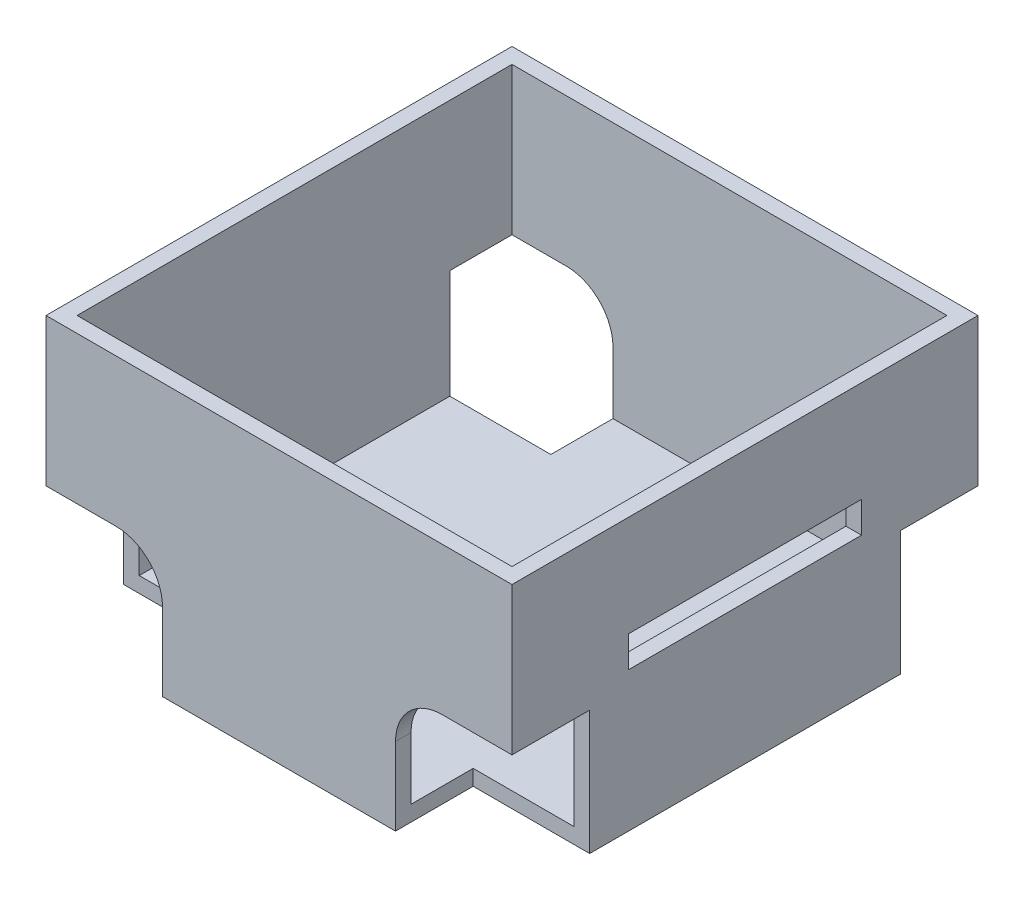
ISO-10303-21;
HEADER;
FILE_DESCRIPTION(('STEP AP214'),'2;1');
FILE_NAME('part.step','',(''),(''),'','','');
FILE_SCHEMA(('AUTOMOTIVE_DESIGN { 1 0 10303 214 1 1 1 1 }'));
ENDSEC;
DATA;
#1=APPLICATION_CONTEXT('core data for automotive mechanical design processes');
#2=APPLICATION_PROTOCOL_DEFINITION('international standard','automotive_design',2000,#1);
#3=PRODUCT_CONTEXT('',#1,'mechanical');
#4=PRODUCT('Part','Part','',(#3));
#5=PRODUCT_RELATED_PRODUCT_CATEGORY('part','',(#4));
#6=PRODUCT_DEFINITION_FORMATION('','',#4);
#7=PRODUCT_DEFINITION_CONTEXT('part definition',#1,'design');
#8=PRODUCT_DEFINITION('design','',#6,#7);
#9=PRODUCT_DEFINITION_SHAPE('','',#8);
#10=(LENGTH_UNIT() NAMED_UNIT(*) SI_UNIT(.MILLI.,.METRE.));
#11=(NAMED_UNIT(*) PLANE_ANGLE_UNIT() SI_UNIT($,.RADIAN.));
#12=(NAMED_UNIT(*) SI_UNIT($,.STERADIAN.) SOLID_ANGLE_UNIT());
#13=UNCERTAINTY_MEASURE_WITH_UNIT(LENGTH_MEASURE(1.E-05),#10,'distance_accuracy_value','');
#14=(GEOMETRIC_REPRESENTATION_CONTEXT(3) GLOBAL_UNCERTAINTY_ASSIGNED_CONTEXT((#13)) GLOBAL_UNIT_ASSIGNED_CONTEXT((#10,
#11,#12)) REPRESENTATION_CONTEXT('',''));
#15=CARTESIAN_POINT('',(0.,0.,0.));
#16=DIRECTION('',(0.,0.,1.));
#17=DIRECTION('',(1.,0.,0.));
#18=AXIS2_PLACEMENT_3D('',#15,#16,#17);
#19=CARTESIAN_POINT('',(0.,175.,0.));
#20=DIRECTION('',(0.,-1.,0.));
#21=DIRECTION('',(0.,0.,-1.));
#22=AXIS2_PLACEMENT_3D('',#19,#20,#21);
#23=PLANE('',#22);
#24=DIRECTION('',(0.,0.,-1.));
#25=VECTOR('',#24,1.);
#26=CARTESIAN_POINT('',(150.,175.,150.));
#27=LINE('',#26,#25);
#28=CARTESIAN_POINT('',(150.,175.,150.));
#29=VERTEX_POINT('',#28);
#30=CARTESIAN_POINT('',(150.,175.,-150.));
#31=VERTEX_POINT('',#30);
#32=EDGE_CURVE('E475',#29,#31,#27,.T.);
#33=ORIENTED_EDGE('',*,*,#32,.T.);
#34=DIRECTION('',(-1.,0.,0.));
#35=VECTOR('',#34,1.);
#36=CARTESIAN_POINT('',(-150.,175.,-150.));
#37=LINE('',#36,#35);
#38=CARTESIAN_POINT('',(-150.,175.,-150.));
#39=VERTEX_POINT('',#38);
#40=EDGE_CURVE('E478',#31,#39,#37,.T.);
#41=ORIENTED_EDGE('',*,*,#40,.T.);
#42=DIRECTION('',(0.,0.,1.));
#43=VECTOR('',#42,1.);
#44=CARTESIAN_POINT('',(-150.,175.,150.));
#45=LINE('',#44,#43);
#46=CARTESIAN_POINT('',(-150.,175.,150.));
#47=VERTEX_POINT('',#46);
#48=EDGE_CURVE('E481',#39,#47,#45,.T.);
#49=ORIENTED_EDGE('',*,*,#48,.T.);
#50=DIRECTION('',(1.,0.,0.));
#51=VECTOR('',#50,1.);
#52=CARTESIAN_POINT('',(-150.,175.,150.));
#53=LINE('',#52,#51);
#54=EDGE_CURVE('E483',#47,#29,#53,.T.);
#55=ORIENTED_EDGE('',*,*,#54,.T.);
#56=EDGE_LOOP('',(#33,#41,#49,#55));
#57=FACE_BOUND('',#56,.T.);
#58=DIRECTION('',(0.,0.,-1.));
#59=VECTOR('',#58,1.);
#60=CARTESIAN_POINT('',(140.,175.,0.));
#61=LINE('',#60,#59);
#62=CARTESIAN_POINT('',(140.,175.,140.));
#63=VERTEX_POINT('',#62);
#64=CARTESIAN_POINT('',(140.,175.,-140.));
#65=VERTEX_POINT('',#64);
#66=EDGE_CURVE('E467',#63,#65,#61,.T.);
#67=ORIENTED_EDGE('',*,*,#66,.F.);
#68=DIRECTION('',(1.,0.,0.));
#69=VECTOR('',#68,1.);
#70=CARTESIAN_POINT('',(0.,175.,140.));
#71=LINE('',#70,#69);
#72=CARTESIAN_POINT('',(-140.,175.,140.));
#73=VERTEX_POINT('',#72);
#74=EDGE_CURVE('E455',#73,#63,#71,.T.);
#75=ORIENTED_EDGE('',*,*,#74,.F.);
#76=DIRECTION('',(0.,0.,1.));
#77=VECTOR('',#76,1.);
#78=CARTESIAN_POINT('',(-140.,175.,0.));
#79=LINE('',#78,#77);
#80=CARTESIAN_POINT('',(-140.,175.,-140.));
#81=VERTEX_POINT('',#80);
#82=EDGE_CURVE('E471',#81,#73,#79,.T.);
#83=ORIENTED_EDGE('',*,*,#82,.F.);
#84=DIRECTION('',(-1.,0.,0.));
#85=VECTOR('',#84,1.);
#86=CARTESIAN_POINT('',(0.,175.,-140.));
#87=LINE('',#86,#85);
#88=EDGE_CURVE('E469',#65,#81,#87,.T.);
#89=ORIENTED_EDGE('',*,*,#88,.F.);
#90=EDGE_LOOP('',(#67,#75,#83,#89));
#91=FACE_BOUND('',#90,.T.);
#92=ADVANCED_FACE('F41',(#57,#91),#23,.F.);
#93=CARTESIAN_POINT('',(150.,175.,150.));
#94=DIRECTION('',(-1.,0.,0.));
#95=DIRECTION('',(0.,0.,1.));
#96=AXIS2_PLACEMENT_3D('',#93,#94,#95);
#97=PLANE('',#96);
#98=DIRECTION('',(0.,0.,1.));
#99=VECTOR('',#98,1.);
#100=CARTESIAN_POINT('',(150.,89.9999999999999,150.));
#101=LINE('',#100,#99);
#102=CARTESIAN_POINT('',(150.,89.9999999999999,-75.));
#103=VERTEX_POINT('',#102);
#104=CARTESIAN_POINT('',(150.,89.9999999999999,75.));
#105=VERTEX_POINT('',#104);
#106=EDGE_CURVE('E306',#103,#105,#101,.T.);
#107=ORIENTED_EDGE('',*,*,#106,.T.);
#108=DIRECTION('',(0.,1.,0.));
#109=VECTOR('',#108,1.);
#110=CARTESIAN_POINT('',(150.,175.,75.));
#111=LINE('',#110,#109);
#112=CARTESIAN_POINT('',(150.,110.,75.));
#113=VERTEX_POINT('',#112);
#114=EDGE_CURVE('E276',#105,#113,#111,.T.);
#115=ORIENTED_EDGE('',*,*,#114,.T.);
#116=DIRECTION('',(0.,0.,1.));
#117=VECTOR('',#116,1.);
#118=CARTESIAN_POINT('',(150.,110.,150.));
#119=LINE('',#118,#117);
#120=CARTESIAN_POINT('',(150.,110.,-75.));
#121=VERTEX_POINT('',#120);
#122=EDGE_CURVE('E279',#121,#113,#119,.T.);
#123=ORIENTED_EDGE('',*,*,#122,.F.);
#124=DIRECTION('',(0.,1.,0.));
#125=VECTOR('',#124,1.);
#126=CARTESIAN_POINT('',(150.,175.,-74.9999999999999));
#127=LINE('',#126,#125);
#128=EDGE_CURVE('E304',#103,#121,#127,.T.);
#129=ORIENTED_EDGE('',*,*,#128,.F.);
#130=EDGE_LOOP('',(#107,#115,#123,#129));
#131=FACE_BOUND('',#130,.T.);
#132=DIRECTION('',(0.,-1.,0.));
#133=VECTOR('',#132,1.);
#134=CARTESIAN_POINT('',(150.,80.,-100.));
#135=LINE('',#134,#133);
#136=CARTESIAN_POINT('',(150.,80.,-100.));
#137=VERTEX_POINT('',#136);
#138=CARTESIAN_POINT('',(150.,0.,-99.9999999999999));
#139=VERTEX_POINT('',#138);
#140=EDGE_CURVE('E315',#137,#139,#135,.T.);
#141=ORIENTED_EDGE('',*,*,#140,.F.);
#142=DIRECTION('',(0.,0.,-1.));
#143=VECTOR('',#142,1.);
#144=CARTESIAN_POINT('',(150.,80.,-100.));
#145=LINE('',#144,#143);
#146=CARTESIAN_POINT('',(150.,80.,-150.));
#147=VERTEX_POINT('',#146);
#148=EDGE_CURVE('E350',#137,#147,#145,.T.);
#149=ORIENTED_EDGE('',*,*,#148,.T.);
#150=DIRECTION('',(0.,-1.,0.));
#151=VECTOR('',#150,1.);
#152=CARTESIAN_POINT('',(150.,175.,-150.));
#153=LINE('',#152,#151);
#154=EDGE_CURVE('E503',#31,#147,#153,.T.);
#155=ORIENTED_EDGE('',*,*,#154,.F.);
#156=ORIENTED_EDGE('',*,*,#32,.F.);
#157=DIRECTION('',(0.,-1.,0.));
#158=VECTOR('',#157,1.);
#159=CARTESIAN_POINT('',(150.,175.,150.));
#160=LINE('',#159,#158);
#161=CARTESIAN_POINT('',(150.,80.,150.));
#162=VERTEX_POINT('',#161);
#163=EDGE_CURVE('E485',#29,#162,#160,.T.);
#164=ORIENTED_EDGE('',*,*,#163,.T.);
#165=DIRECTION('',(0.,0.,1.));
#166=VECTOR('',#165,1.);
#167=CARTESIAN_POINT('',(150.,80.,100.));
#168=LINE('',#167,#166);
#169=CARTESIAN_POINT('',(150.,80.,100.));
#170=VERTEX_POINT('',#169);
#171=EDGE_CURVE('E415',#170,#162,#168,.T.);
#172=ORIENTED_EDGE('',*,*,#171,.F.);
#173=DIRECTION('',(0.,1.,0.));
#174=VECTOR('',#173,1.);
#175=CARTESIAN_POINT('',(150.,-5.,100.));
#176=LINE('',#175,#174);
#177=CARTESIAN_POINT('',(150.,0.,100.));
#178=VERTEX_POINT('',#177);
#179=EDGE_CURVE('E384',#178,#170,#176,.T.);
#180=ORIENTED_EDGE('',*,*,#179,.F.);
#181=DIRECTION('',(0.,0.,-1.));
#182=VECTOR('',#181,1.);
#183=CARTESIAN_POINT('',(150.,0.,150.));
#184=LINE('',#183,#182);
#185=EDGE_CURVE('E449',#178,#139,#184,.T.);
#186=ORIENTED_EDGE('',*,*,#185,.T.);
#187=EDGE_LOOP('',(#141,#149,#155,#156,#164,#172,#180,#186));
#188=FACE_BOUND('',#187,.T.);
#189=ADVANCED_FACE('F43',(#131,#188),#97,.F.);
#190=CARTESIAN_POINT('',(-150.,175.,-150.));
#191=DIRECTION('',(0.,0.,1.));
#192=DIRECTION('',(1.,0.,0.));
#193=AXIS2_PLACEMENT_3D('',#190,#191,#192);
#194=PLANE('',#193);
#195=DIRECTION('',(-1.,0.,0.));
#196=VECTOR('',#195,1.);
#197=CARTESIAN_POINT('',(-150.,0.,-150.));
#198=LINE('',#197,#196);
#199=CARTESIAN_POINT('',(75.,0.,-150.));
#200=VERTEX_POINT('',#199);
#201=CARTESIAN_POINT('',(-75.,0.,-150.));
#202=VERTEX_POINT('',#201);
#203=EDGE_CURVE('E488',#200,#202,#198,.T.);
#204=ORIENTED_EDGE('',*,*,#203,.T.);
#205=DIRECTION('',(0.,-1.,0.));
#206=VECTOR('',#205,1.);
#207=CARTESIAN_POINT('',(-75.,0.,-150.));
#208=LINE('',#207,#206);
#209=CARTESIAN_POINT('',(-75.,50.,-150.));
#210=VERTEX_POINT('',#209);
#211=EDGE_CURVE('E313',#210,#202,#208,.T.);
#212=ORIENTED_EDGE('',*,*,#211,.F.);
#213=CARTESIAN_POINT('',(-105.,50.,-150.));
#214=DIRECTION('',(0.,0.,-1.));
#215=DIRECTION('',(1.,0.,0.));
#216=AXIS2_PLACEMENT_3D('',#213,#214,#215);
#217=CIRCLE('',#216,30.);
#218=CARTESIAN_POINT('',(-105.,80.,-150.));
#219=VERTEX_POINT('',#218);
#220=EDGE_CURVE('E336',#219,#210,#217,.T.);
#221=ORIENTED_EDGE('',*,*,#220,.F.);
#222=DIRECTION('',(1.,0.,0.));
#223=VECTOR('',#222,1.);
#224=CARTESIAN_POINT('',(-105.,80.,-150.));
#225=LINE('',#224,#223);
#226=CARTESIAN_POINT('',(-150.,80.,-150.));
#227=VERTEX_POINT('',#226);
#228=EDGE_CURVE('E333',#227,#219,#225,.T.);
#229=ORIENTED_EDGE('',*,*,#228,.F.);
#230=DIRECTION('',(0.,-1.,0.));
#231=VECTOR('',#230,1.);
#232=CARTESIAN_POINT('',(-150.,175.,-150.));
#233=LINE('',#232,#231);
#234=EDGE_CURVE('E500',#39,#227,#233,.T.);
#235=ORIENTED_EDGE('',*,*,#234,.F.);
#236=ORIENTED_EDGE('',*,*,#40,.F.);
#237=ORIENTED_EDGE('',*,*,#154,.T.);
#238=DIRECTION('',(1.,0.,0.));
#239=VECTOR('',#238,1.);
#240=CARTESIAN_POINT('',(105.,80.,-150.));
#241=LINE('',#240,#239);
#242=CARTESIAN_POINT('',(105.,80.,-150.));
#243=VERTEX_POINT('',#242);
#244=EDGE_CURVE('E331',#243,#147,#241,.T.);
#245=ORIENTED_EDGE('',*,*,#244,.F.);
#246=CARTESIAN_POINT('',(105.,50.,-150.));
#247=DIRECTION('',(0.,0.,-1.));
#248=DIRECTION('',(-1.,0.,0.));
#249=AXIS2_PLACEMENT_3D('',#246,#247,#248);
#250=CIRCLE('',#249,30.);
#251=CARTESIAN_POINT('',(75.,50.,-150.));
#252=VERTEX_POINT('',#251);
#253=EDGE_CURVE('E328',#252,#243,#250,.T.);
#254=ORIENTED_EDGE('',*,*,#253,.F.);
#255=DIRECTION('',(0.,1.,0.));
#256=VECTOR('',#255,1.);
#257=CARTESIAN_POINT('',(75.,0.,-150.));
#258=LINE('',#257,#256);
#259=EDGE_CURVE('E309',#200,#252,#258,.T.);
#260=ORIENTED_EDGE('',*,*,#259,.F.);
#261=EDGE_LOOP('',(#204,#212,#221,#229,#235,#236,#237,#245,#254,#260));
#262=FACE_BOUND('',#261,.T.);
#263=ADVANCED_FACE('F666',(#262),#194,.F.);
#264=CARTESIAN_POINT('',(-150.,175.,150.));
#265=DIRECTION('',(1.,0.,0.));
#266=DIRECTION('',(0.,0.,-1.));
#267=AXIS2_PLACEMENT_3D('',#264,#265,#266);
#268=PLANE('',#267);
#269=ORIENTED_EDGE('',*,*,#234,.T.);
#270=DIRECTION('',(0.,0.,-1.));
#271=VECTOR('',#270,1.);
#272=CARTESIAN_POINT('',(-150.,80.,-100.));
#273=LINE('',#272,#271);
#274=CARTESIAN_POINT('',(-150.,80.,-100.));
#275=VERTEX_POINT('',#274);
#276=EDGE_CURVE('E348',#275,#227,#273,.T.);
#277=ORIENTED_EDGE('',*,*,#276,.F.);
#278=DIRECTION('',(0.,1.,0.));
#279=VECTOR('',#278,1.);
#280=CARTESIAN_POINT('',(-150.,-5.,-100.));
#281=LINE('',#280,#279);
#282=CARTESIAN_POINT('',(-150.,0.,-100.));
#283=VERTEX_POINT('',#282);
#284=EDGE_CURVE('E317',#283,#275,#281,.T.);
#285=ORIENTED_EDGE('',*,*,#284,.F.);
#286=DIRECTION('',(0.,0.,1.));
#287=VECTOR('',#286,1.);
#288=CARTESIAN_POINT('',(-150.,0.,150.));
#289=LINE('',#288,#287);
#290=CARTESIAN_POINT('',(-150.,0.,100.));
#291=VERTEX_POINT('',#290);
#292=EDGE_CURVE('E491',#283,#291,#289,.T.);
#293=ORIENTED_EDGE('',*,*,#292,.T.);
#294=DIRECTION('',(0.,-1.,0.));
#295=VECTOR('',#294,1.);
#296=CARTESIAN_POINT('',(-150.,80.,100.));
#297=LINE('',#296,#295);
#298=CARTESIAN_POINT('',(-150.,80.,100.));
#299=VERTEX_POINT('',#298);
#300=EDGE_CURVE('E381',#299,#291,#297,.T.);
#301=ORIENTED_EDGE('',*,*,#300,.F.);
#302=DIRECTION('',(0.,0.,1.));
#303=VECTOR('',#302,1.);
#304=CARTESIAN_POINT('',(-150.,80.,100.));
#305=LINE('',#304,#303);
#306=CARTESIAN_POINT('',(-150.,80.,150.));
#307=VERTEX_POINT('',#306);
#308=EDGE_CURVE('E417',#299,#307,#305,.T.);
#309=ORIENTED_EDGE('',*,*,#308,.T.);
#310=DIRECTION('',(0.,-1.,0.));
#311=VECTOR('',#310,1.);
#312=CARTESIAN_POINT('',(-150.,175.,150.));
#313=LINE('',#312,#311);
#314=EDGE_CURVE('E497',#47,#307,#313,.T.);
#315=ORIENTED_EDGE('',*,*,#314,.F.);
#316=ORIENTED_EDGE('',*,*,#48,.F.);
#317=EDGE_LOOP('',(#269,#277,#285,#293,#301,#309,#315,#316));
#318=FACE_BOUND('',#317,.T.);
#319=ADVANCED_FACE('F606',(#318),#268,.F.);
#320=CARTESIAN_POINT('',(-150.,175.,150.));
#321=DIRECTION('',(0.,0.,-1.));
#322=DIRECTION('',(-1.,0.,0.));
#323=AXIS2_PLACEMENT_3D('',#320,#321,#322);
#324=PLANE('',#323);
#325=DIRECTION('',(1.,0.,0.));
#326=VECTOR('',#325,1.);
#327=CARTESIAN_POINT('',(-150.,0.,150.));
#328=LINE('',#327,#326);
#329=CARTESIAN_POINT('',(-75.,0.,150.));
#330=VERTEX_POINT('',#329);
#331=CARTESIAN_POINT('',(75.,0.,150.));
#332=VERTEX_POINT('',#331);
#333=EDGE_CURVE('E479',#330,#332,#328,.T.);
#334=ORIENTED_EDGE('',*,*,#333,.T.);
#335=DIRECTION('',(0.,-1.,0.));
#336=VECTOR('',#335,1.);
#337=CARTESIAN_POINT('',(75.,0.,150.));
#338=LINE('',#337,#336);
#339=CARTESIAN_POINT('',(75.,50.,150.));
#340=VERTEX_POINT('',#339);
#341=EDGE_CURVE('E379',#340,#332,#338,.T.);
#342=ORIENTED_EDGE('',*,*,#341,.F.);
#343=CARTESIAN_POINT('',(105.,50.,150.));
#344=DIRECTION('',(0.,0.,1.));
#345=DIRECTION('',(-1.,0.,0.));
#346=AXIS2_PLACEMENT_3D('',#343,#344,#345);
#347=CIRCLE('',#346,30.);
#348=CARTESIAN_POINT('',(105.,80.,150.));
#349=VERTEX_POINT('',#348);
#350=EDGE_CURVE('E403',#349,#340,#347,.T.);
#351=ORIENTED_EDGE('',*,*,#350,.F.);
#352=DIRECTION('',(-1.,0.,0.));
#353=VECTOR('',#352,1.);
#354=CARTESIAN_POINT('',(105.,80.,150.));
#355=LINE('',#354,#353);
#356=EDGE_CURVE('E400',#162,#349,#355,.T.);
#357=ORIENTED_EDGE('',*,*,#356,.F.);
#358=ORIENTED_EDGE('',*,*,#163,.F.);
#359=ORIENTED_EDGE('',*,*,#54,.F.);
#360=ORIENTED_EDGE('',*,*,#314,.T.);
#361=DIRECTION('',(-1.,0.,0.));
#362=VECTOR('',#361,1.);
#363=CARTESIAN_POINT('',(-105.,80.,150.));
#364=LINE('',#363,#362);
#365=CARTESIAN_POINT('',(-105.,80.,150.));
#366=VERTEX_POINT('',#365);
#367=EDGE_CURVE('E398',#366,#307,#364,.T.);
#368=ORIENTED_EDGE('',*,*,#367,.F.);
#369=CARTESIAN_POINT('',(-105.,50.,150.));
#370=DIRECTION('',(0.,0.,1.));
#371=DIRECTION('',(1.,0.,0.));
#372=AXIS2_PLACEMENT_3D('',#369,#370,#371);
#373=CIRCLE('',#372,30.);
#374=CARTESIAN_POINT('',(-75.,50.,150.));
#375=VERTEX_POINT('',#374);
#376=EDGE_CURVE('E395',#375,#366,#373,.T.);
#377=ORIENTED_EDGE('',*,*,#376,.F.);
#378=DIRECTION('',(0.,1.,0.));
#379=VECTOR('',#378,1.);
#380=CARTESIAN_POINT('',(-75.,0.,150.));
#381=LINE('',#380,#379);
#382=EDGE_CURVE('E375',#330,#375,#381,.T.);
#383=ORIENTED_EDGE('',*,*,#382,.F.);
#384=EDGE_LOOP('',(#334,#342,#351,#357,#358,#359,#360,#368,#377,#383));
#385=FACE_BOUND('',#384,.T.);
#386=ADVANCED_FACE('F622',(#385),#324,.F.);
#387=CARTESIAN_POINT('',(0.,0.,0.));
#388=DIRECTION('',(0.,-1.,0.));
#389=DIRECTION('',(0.,0.,-1.));
#390=AXIS2_PLACEMENT_3D('',#387,#388,#389);
#391=PLANE('',#390);
#392=DIRECTION('',(0.,0.,-1.));
#393=VECTOR('',#392,1.);
#394=CARTESIAN_POINT('',(-75.,0.,-100.));
#395=LINE('',#394,#393);
#396=CARTESIAN_POINT('',(-75.,0.,-100.));
#397=VERTEX_POINT('',#396);
#398=EDGE_CURVE('E340',#397,#202,#395,.T.);
#399=ORIENTED_EDGE('',*,*,#398,.T.);
#400=ORIENTED_EDGE('',*,*,#203,.F.);
#401=DIRECTION('',(0.,0.,-1.));
#402=VECTOR('',#401,1.);
#403=CARTESIAN_POINT('',(75.,0.,-100.));
#404=LINE('',#403,#402);
#405=CARTESIAN_POINT('',(75.,0.,-100.));
#406=VERTEX_POINT('',#405);
#407=EDGE_CURVE('E325',#406,#200,#404,.T.);
#408=ORIENTED_EDGE('',*,*,#407,.F.);
#409=DIRECTION('',(1.,0.,0.));
#410=VECTOR('',#409,1.);
#411=CARTESIAN_POINT('',(0.,0.,-100.));
#412=LINE('',#411,#410);
#413=EDGE_CURVE('E363',#406,#139,#412,.T.);
#414=ORIENTED_EDGE('',*,*,#413,.T.);
#415=ORIENTED_EDGE('',*,*,#185,.F.);
#416=DIRECTION('',(-1.,0.,0.));
#417=VECTOR('',#416,1.);
#418=CARTESIAN_POINT('',(0.,0.,100.));
#419=LINE('',#418,#417);
#420=CARTESIAN_POINT('',(75.,0.,100.));
#421=VERTEX_POINT('',#420);
#422=EDGE_CURVE('E433',#178,#421,#419,.T.);
#423=ORIENTED_EDGE('',*,*,#422,.T.);
#424=DIRECTION('',(0.,0.,1.));
#425=VECTOR('',#424,1.);
#426=CARTESIAN_POINT('',(75.,0.,100.));
#427=LINE('',#426,#425);
#428=EDGE_CURVE('E407',#421,#332,#427,.T.);
#429=ORIENTED_EDGE('',*,*,#428,.T.);
#430=ORIENTED_EDGE('',*,*,#333,.F.);
#431=DIRECTION('',(0.,0.,1.));
#432=VECTOR('',#431,1.);
#433=CARTESIAN_POINT('',(-75.,0.,100.));
#434=LINE('',#433,#432);
#435=CARTESIAN_POINT('',(-75.,0.,100.));
#436=VERTEX_POINT('',#435);
#437=EDGE_CURVE('E392',#436,#330,#434,.T.);
#438=ORIENTED_EDGE('',*,*,#437,.F.);
#439=EDGE_CURVE('E430',#436,#291,#419,.T.);
#440=ORIENTED_EDGE('',*,*,#439,.T.);
#441=ORIENTED_EDGE('',*,*,#292,.F.);
#442=EDGE_CURVE('E366',#283,#397,#412,.T.);
#443=ORIENTED_EDGE('',*,*,#442,.T.);
#444=EDGE_LOOP('',(#399,#400,#408,#414,#415,#423,#429,#430,#438,#440,#441,#443));
#445=FACE_BOUND('',#444,.T.);
#446=ADVANCED_FACE('F612',(#445),#391,.T.);
#447=CARTESIAN_POINT('',(140.,175.,150.));
#448=DIRECTION('',(-1.,0.,0.));
#449=DIRECTION('',(0.,0.,1.));
#450=AXIS2_PLACEMENT_3D('',#447,#448,#449);
#451=PLANE('',#450);
#452=DIRECTION('',(0.,1.,0.));
#453=VECTOR('',#452,1.);
#454=CARTESIAN_POINT('',(140.,0.,75.));
#455=LINE('',#454,#453);
#456=CARTESIAN_POINT('',(140.,89.9999999999999,75.));
#457=VERTEX_POINT('',#456);
#458=CARTESIAN_POINT('',(140.,110.,75.));
#459=VERTEX_POINT('',#458);
#460=EDGE_CURVE('E64',#457,#459,#455,.T.);
#461=ORIENTED_EDGE('',*,*,#460,.F.);
#462=DIRECTION('',(0.,0.,1.));
#463=VECTOR('',#462,1.);
#464=CARTESIAN_POINT('',(140.,89.9999999999999,0.));
#465=LINE('',#464,#463);
#466=CARTESIAN_POINT('',(140.,89.9999999999999,-75.));
#467=VERTEX_POINT('',#466);
#468=EDGE_CURVE('E283',#467,#457,#465,.T.);
#469=ORIENTED_EDGE('',*,*,#468,.F.);
#470=DIRECTION('',(0.,1.,0.));
#471=VECTOR('',#470,1.);
#472=CARTESIAN_POINT('',(140.,1.04083408558609E-13,-75.0000000000001));
#473=LINE('',#472,#471);
#474=CARTESIAN_POINT('',(140.,110.,-75.));
#475=VERTEX_POINT('',#474);
#476=EDGE_CURVE('E296',#467,#475,#473,.T.);
#477=ORIENTED_EDGE('',*,*,#476,.T.);
#478=DIRECTION('',(0.,0.,1.));
#479=VECTOR('',#478,1.);
#480=CARTESIAN_POINT('',(140.,110.,0.));
#481=LINE('',#480,#479);
#482=EDGE_CURVE('E294',#475,#459,#481,.T.);
#483=ORIENTED_EDGE('',*,*,#482,.T.);
#484=EDGE_LOOP('',(#461,#469,#477,#483));
#485=FACE_BOUND('',#484,.T.);
#486=DIRECTION('',(0.,0.,-1.));
#487=VECTOR('',#486,1.);
#488=CARTESIAN_POINT('',(140.,80.,150.));
#489=LINE('',#488,#487);
#490=CARTESIAN_POINT('',(140.,80.,-100.));
#491=VERTEX_POINT('',#490);
#492=CARTESIAN_POINT('',(140.,80.,-140.));
#493=VERTEX_POINT('',#492);
#494=EDGE_CURVE('E373',#491,#493,#489,.T.);
#495=ORIENTED_EDGE('',*,*,#494,.F.);
#496=DIRECTION('',(0.,-1.,0.));
#497=VECTOR('',#496,1.);
#498=CARTESIAN_POINT('',(140.,175.,-99.9999999999999));
#499=LINE('',#498,#497);
#500=CARTESIAN_POINT('',(140.,10.,-100.));
#501=VERTEX_POINT('',#500);
#502=EDGE_CURVE('E343',#491,#501,#499,.T.);
#503=ORIENTED_EDGE('',*,*,#502,.T.);
#504=DIRECTION('',(0.,0.,-1.));
#505=VECTOR('',#504,1.);
#506=CARTESIAN_POINT('',(140.,10.,0.));
#507=LINE('',#506,#505);
#508=CARTESIAN_POINT('',(140.,10.,100.));
#509=VERTEX_POINT('',#508);
#510=EDGE_CURVE('E442',#509,#501,#507,.T.);
#511=ORIENTED_EDGE('',*,*,#510,.F.);
#512=DIRECTION('',(0.,1.,0.));
#513=VECTOR('',#512,1.);
#514=CARTESIAN_POINT('',(140.,175.,100.));
#515=LINE('',#514,#513);
#516=CARTESIAN_POINT('',(140.,80.,100.));
#517=VERTEX_POINT('',#516);
#518=EDGE_CURVE('E427',#509,#517,#515,.T.);
#519=ORIENTED_EDGE('',*,*,#518,.T.);
#520=DIRECTION('',(0.,0.,-1.));
#521=VECTOR('',#520,1.);
#522=CARTESIAN_POINT('',(140.,80.,150.));
#523=LINE('',#522,#521);
#524=CARTESIAN_POINT('',(140.,80.,140.));
#525=VERTEX_POINT('',#524);
#526=EDGE_CURVE('E440',#525,#517,#523,.T.);
#527=ORIENTED_EDGE('',*,*,#526,.F.);
#528=DIRECTION('',(0.,-1.,0.));
#529=VECTOR('',#528,1.);
#530=CARTESIAN_POINT('',(140.,175.,140.));
#531=LINE('',#530,#529);
#532=EDGE_CURVE('E451',#63,#525,#531,.T.);
#533=ORIENTED_EDGE('',*,*,#532,.F.);
#534=ORIENTED_EDGE('',*,*,#66,.T.);
#535=DIRECTION('',(0.,-1.,0.));
#536=VECTOR('',#535,1.);
#537=CARTESIAN_POINT('',(140.,175.,-140.));
#538=LINE('',#537,#536);
#539=EDGE_CURVE('E446',#65,#493,#538,.T.);
#540=ORIENTED_EDGE('',*,*,#539,.T.);
#541=EDGE_LOOP('',(#495,#503,#511,#519,#527,#533,#534,#540));
#542=FACE_BOUND('',#541,.T.);
#543=ADVANCED_FACE('F292',(#485,#542),#451,.T.);
#544=CARTESIAN_POINT('',(-150.,175.,-140.));
#545=DIRECTION('',(0.,0.,1.));
#546=DIRECTION('',(1.,0.,0.));
#547=AXIS2_PLACEMENT_3D('',#544,#545,#546);
#548=PLANE('',#547);
#549=DIRECTION('',(0.,1.,0.));
#550=VECTOR('',#549,1.);
#551=CARTESIAN_POINT('',(-75.,175.,-140.));
#552=LINE('',#551,#550);
#553=CARTESIAN_POINT('',(-75.,10.,-140.));
#554=VERTEX_POINT('',#553);
#555=CARTESIAN_POINT('',(-75.,50.,-140.));
#556=VERTEX_POINT('',#555);
#557=EDGE_CURVE('E369',#554,#556,#552,.T.);
#558=ORIENTED_EDGE('',*,*,#557,.F.);
#559=DIRECTION('',(-1.,0.,0.));
#560=VECTOR('',#559,1.);
#561=CARTESIAN_POINT('',(0.,10.,-140.));
#562=LINE('',#561,#560);
#563=CARTESIAN_POINT('',(75.,10.,-140.));
#564=VERTEX_POINT('',#563);
#565=EDGE_CURVE('E445',#564,#554,#562,.T.);
#566=ORIENTED_EDGE('',*,*,#565,.F.);
#567=DIRECTION('',(0.,-1.,0.));
#568=VECTOR('',#567,1.);
#569=CARTESIAN_POINT('',(75.,175.,-140.));
#570=LINE('',#569,#568);
#571=CARTESIAN_POINT('',(75.,50.,-140.));
#572=VERTEX_POINT('',#571);
#573=EDGE_CURVE('E367',#572,#564,#570,.T.);
#574=ORIENTED_EDGE('',*,*,#573,.F.);
#575=CARTESIAN_POINT('',(105.,50.,-140.));
#576=DIRECTION('',(0.,0.,1.));
#577=DIRECTION('',(1.,0.,0.));
#578=AXIS2_PLACEMENT_3D('',#575,#576,#577);
#579=CIRCLE('',#578,30.);
#580=CARTESIAN_POINT('',(105.,80.,-140.));
#581=VERTEX_POINT('',#580);
#582=EDGE_CURVE('E535',#581,#572,#579,.T.);
#583=ORIENTED_EDGE('',*,*,#582,.F.);
#584=DIRECTION('',(-1.,0.,0.));
#585=VECTOR('',#584,1.);
#586=CARTESIAN_POINT('',(-150.,80.0000000000001,-140.));
#587=LINE('',#586,#585);
#588=EDGE_CURVE('E49',#493,#581,#587,.T.);
#589=ORIENTED_EDGE('',*,*,#588,.F.);
#590=ORIENTED_EDGE('',*,*,#539,.F.);
#591=ORIENTED_EDGE('',*,*,#88,.T.);
#592=DIRECTION('',(0.,-1.,0.));
#593=VECTOR('',#592,1.);
#594=CARTESIAN_POINT('',(-140.,175.,-140.));
#595=LINE('',#594,#593);
#596=CARTESIAN_POINT('',(-140.,80.,-140.));
#597=VERTEX_POINT('',#596);
#598=EDGE_CURVE('E450',#81,#597,#595,.T.);
#599=ORIENTED_EDGE('',*,*,#598,.T.);
#600=DIRECTION('',(-1.,0.,0.));
#601=VECTOR('',#600,1.);
#602=CARTESIAN_POINT('',(-150.,80.,-140.));
#603=LINE('',#602,#601);
#604=CARTESIAN_POINT('',(-105.,80.,-140.));
#605=VERTEX_POINT('',#604);
#606=EDGE_CURVE('E371',#605,#597,#603,.T.);
#607=ORIENTED_EDGE('',*,*,#606,.F.);
#608=CARTESIAN_POINT('',(-105.,50.,-140.));
#609=DIRECTION('',(0.,0.,1.));
#610=DIRECTION('',(1.,0.,0.));
#611=AXIS2_PLACEMENT_3D('',#608,#609,#610);
#612=CIRCLE('',#611,30.);
#613=EDGE_CURVE('E11',#556,#605,#612,.T.);
#614=ORIENTED_EDGE('',*,*,#613,.F.);
#615=EDGE_LOOP('',(#558,#566,#574,#583,#589,#590,#591,#599,#607,#614));
#616=FACE_BOUND('',#615,.T.);
#617=ADVANCED_FACE('F552',(#616),#548,.T.);
#618=CARTESIAN_POINT('',(-140.,175.,150.));
#619=DIRECTION('',(1.,0.,0.));
#620=DIRECTION('',(0.,0.,-1.));
#621=AXIS2_PLACEMENT_3D('',#618,#619,#620);
#622=PLANE('',#621);
#623=DIRECTION('',(0.,0.,1.));
#624=VECTOR('',#623,1.);
#625=CARTESIAN_POINT('',(-140.,80.,150.));
#626=LINE('',#625,#624);
#627=CARTESIAN_POINT('',(-140.,80.,-100.));
#628=VERTEX_POINT('',#627);
#629=EDGE_CURVE('E533',#597,#628,#626,.T.);
#630=ORIENTED_EDGE('',*,*,#629,.F.);
#631=ORIENTED_EDGE('',*,*,#598,.F.);
#632=ORIENTED_EDGE('',*,*,#82,.T.);
#633=DIRECTION('',(0.,-1.,0.));
#634=VECTOR('',#633,1.);
#635=CARTESIAN_POINT('',(-140.,175.,140.));
#636=LINE('',#635,#634);
#637=CARTESIAN_POINT('',(-140.,80.,140.));
#638=VERTEX_POINT('',#637);
#639=EDGE_CURVE('E454',#73,#638,#636,.T.);
#640=ORIENTED_EDGE('',*,*,#639,.T.);
#641=DIRECTION('',(0.,0.,1.));
#642=VECTOR('',#641,1.);
#643=CARTESIAN_POINT('',(-140.,80.,150.));
#644=LINE('',#643,#642);
#645=CARTESIAN_POINT('',(-140.,80.,100.));
#646=VERTEX_POINT('',#645);
#647=EDGE_CURVE('E438',#646,#638,#644,.T.);
#648=ORIENTED_EDGE('',*,*,#647,.F.);
#649=DIRECTION('',(0.,-1.,0.));
#650=VECTOR('',#649,1.);
#651=CARTESIAN_POINT('',(-140.,175.,100.));
#652=LINE('',#651,#650);
#653=CARTESIAN_POINT('',(-140.,10.,100.));
#654=VERTEX_POINT('',#653);
#655=EDGE_CURVE('E410',#646,#654,#652,.T.);
#656=ORIENTED_EDGE('',*,*,#655,.T.);
#657=DIRECTION('',(0.,0.,1.));
#658=VECTOR('',#657,1.);
#659=CARTESIAN_POINT('',(-140.,10.,0.));
#660=LINE('',#659,#658);
#661=CARTESIAN_POINT('',(-140.,10.,-100.));
#662=VERTEX_POINT('',#661);
#663=EDGE_CURVE('E458',#662,#654,#660,.T.);
#664=ORIENTED_EDGE('',*,*,#663,.F.);
#665=DIRECTION('',(0.,1.,0.));
#666=VECTOR('',#665,1.);
#667=CARTESIAN_POINT('',(-140.,175.,-99.9999999999999));
#668=LINE('',#667,#666);
#669=EDGE_CURVE('E360',#662,#628,#668,.T.);
#670=ORIENTED_EDGE('',*,*,#669,.T.);
#671=EDGE_LOOP('',(#630,#631,#632,#640,#648,#656,#664,#670));
#672=FACE_BOUND('',#671,.T.);
#673=ADVANCED_FACE('F574',(#672),#622,.T.);
#674=CARTESIAN_POINT('',(-150.,175.,140.));
#675=DIRECTION('',(0.,0.,-1.));
#676=DIRECTION('',(-1.,0.,0.));
#677=AXIS2_PLACEMENT_3D('',#674,#675,#676);
#678=PLANE('',#677);
#679=DIRECTION('',(0.,1.,0.));
#680=VECTOR('',#679,1.);
#681=CARTESIAN_POINT('',(74.9999999999999,175.,140.));
#682=LINE('',#681,#680);
#683=CARTESIAN_POINT('',(75.,10.,140.));
#684=VERTEX_POINT('',#683);
#685=CARTESIAN_POINT('',(75.,50.,140.));
#686=VERTEX_POINT('',#685);
#687=EDGE_CURVE('E436',#684,#686,#682,.T.);
#688=ORIENTED_EDGE('',*,*,#687,.F.);
#689=DIRECTION('',(1.,0.,0.));
#690=VECTOR('',#689,1.);
#691=CARTESIAN_POINT('',(0.,10.,140.));
#692=LINE('',#691,#690);
#693=CARTESIAN_POINT('',(-75.,10.,140.));
#694=VERTEX_POINT('',#693);
#695=EDGE_CURVE('E462',#694,#684,#692,.T.);
#696=ORIENTED_EDGE('',*,*,#695,.F.);
#697=DIRECTION('',(0.,-1.,0.));
#698=VECTOR('',#697,1.);
#699=CARTESIAN_POINT('',(-75.,175.,140.));
#700=LINE('',#699,#698);
#701=CARTESIAN_POINT('',(-75.,50.,140.));
#702=VERTEX_POINT('',#701);
#703=EDGE_CURVE('E434',#702,#694,#700,.T.);
#704=ORIENTED_EDGE('',*,*,#703,.F.);
#705=CARTESIAN_POINT('',(-105.,50.,140.));
#706=DIRECTION('',(0.,0.,-1.));
#707=DIRECTION('',(-1.,0.,0.));
#708=AXIS2_PLACEMENT_3D('',#705,#706,#707);
#709=CIRCLE('',#708,30.);
#710=CARTESIAN_POINT('',(-105.,80.,140.));
#711=VERTEX_POINT('',#710);
#712=EDGE_CURVE('E516',#711,#702,#709,.T.);
#713=ORIENTED_EDGE('',*,*,#712,.F.);
#714=DIRECTION('',(1.,0.,0.));
#715=VECTOR('',#714,1.);
#716=CARTESIAN_POINT('',(-150.,80.,140.));
#717=LINE('',#716,#715);
#718=EDGE_CURVE('E518',#638,#711,#717,.T.);
#719=ORIENTED_EDGE('',*,*,#718,.F.);
#720=ORIENTED_EDGE('',*,*,#639,.F.);
#721=ORIENTED_EDGE('',*,*,#74,.T.);
#722=ORIENTED_EDGE('',*,*,#532,.T.);
#723=DIRECTION('',(1.,0.,0.));
#724=VECTOR('',#723,1.);
#725=CARTESIAN_POINT('',(-150.,80.,140.));
#726=LINE('',#725,#724);
#727=CARTESIAN_POINT('',(105.,80.,140.));
#728=VERTEX_POINT('',#727);
#729=EDGE_CURVE('E520',#728,#525,#726,.T.);
#730=ORIENTED_EDGE('',*,*,#729,.F.);
#731=CARTESIAN_POINT('',(105.,50.,140.));
#732=DIRECTION('',(0.,0.,-1.));
#733=DIRECTION('',(-1.,0.,0.));
#734=AXIS2_PLACEMENT_3D('',#731,#732,#733);
#735=CIRCLE('',#734,30.);
#736=EDGE_CURVE('E522',#686,#728,#735,.T.);
#737=ORIENTED_EDGE('',*,*,#736,.F.);
#738=EDGE_LOOP('',(#688,#696,#704,#713,#719,#720,#721,#722,#730,#737));
#739=FACE_BOUND('',#738,.T.);
#740=ADVANCED_FACE('F632',(#739),#678,.T.);
#741=CARTESIAN_POINT('',(0.,10.,0.));
#742=DIRECTION('',(0.,-1.,0.));
#743=DIRECTION('',(0.,0.,-1.));
#744=AXIS2_PLACEMENT_3D('',#741,#742,#743);
#745=PLANE('',#744);
#746=ORIENTED_EDGE('',*,*,#565,.T.);
#747=DIRECTION('',(0.,0.,1.));
#748=VECTOR('',#747,1.);
#749=CARTESIAN_POINT('',(-75.,10.,0.));
#750=LINE('',#749,#748);
#751=CARTESIAN_POINT('',(-75.,10.,-100.));
#752=VERTEX_POINT('',#751);
#753=EDGE_CURVE('E530',#554,#752,#750,.T.);
#754=ORIENTED_EDGE('',*,*,#753,.T.);
#755=DIRECTION('',(1.,0.,0.));
#756=VECTOR('',#755,1.);
#757=CARTESIAN_POINT('',(0.,10.,-100.));
#758=LINE('',#757,#756);
#759=EDGE_CURVE('E527',#662,#752,#758,.T.);
#760=ORIENTED_EDGE('',*,*,#759,.F.);
#761=ORIENTED_EDGE('',*,*,#663,.T.);
#762=DIRECTION('',(-1.,0.,0.));
#763=VECTOR('',#762,1.);
#764=CARTESIAN_POINT('',(0.,10.,100.));
#765=LINE('',#764,#763);
#766=CARTESIAN_POINT('',(-75.,10.,100.));
#767=VERTEX_POINT('',#766);
#768=EDGE_CURVE('E506',#767,#654,#765,.T.);
#769=ORIENTED_EDGE('',*,*,#768,.F.);
#770=DIRECTION('',(0.,0.,1.));
#771=VECTOR('',#770,1.);
#772=CARTESIAN_POINT('',(-75.,10.,0.));
#773=LINE('',#772,#771);
#774=EDGE_CURVE('E509',#767,#694,#773,.T.);
#775=ORIENTED_EDGE('',*,*,#774,.T.);
#776=ORIENTED_EDGE('',*,*,#695,.T.);
#777=DIRECTION('',(0.,0.,-1.));
#778=VECTOR('',#777,1.);
#779=CARTESIAN_POINT('',(75.,10.,0.));
#780=LINE('',#779,#778);
#781=CARTESIAN_POINT('',(75.,10.,100.));
#782=VERTEX_POINT('',#781);
#783=EDGE_CURVE('E513',#684,#782,#780,.T.);
#784=ORIENTED_EDGE('',*,*,#783,.T.);
#785=EDGE_CURVE('E510',#509,#782,#765,.T.);
#786=ORIENTED_EDGE('',*,*,#785,.F.);
#787=ORIENTED_EDGE('',*,*,#510,.T.);
#788=CARTESIAN_POINT('',(75.,10.,-100.));
#789=VERTEX_POINT('',#788);
#790=EDGE_CURVE('E524',#789,#501,#758,.T.);
#791=ORIENTED_EDGE('',*,*,#790,.F.);
#792=DIRECTION('',(0.,0.,-1.));
#793=VECTOR('',#792,1.);
#794=CARTESIAN_POINT('',(75.,10.,0.));
#795=LINE('',#794,#793);
#796=EDGE_CURVE('E526',#789,#564,#795,.T.);
#797=ORIENTED_EDGE('',*,*,#796,.T.);
#798=EDGE_LOOP('',(#746,#754,#760,#761,#769,#775,#776,#784,#786,#787,#791,#797));
#799=FACE_BOUND('',#798,.T.);
#800=ADVANCED_FACE('F560',(#799),#745,.F.);
#801=CARTESIAN_POINT('',(-105.,50.,100.));
#802=DIRECTION('',(0.,0.,1.));
#803=DIRECTION('',(1.,0.,0.));
#804=AXIS2_PLACEMENT_3D('',#801,#802,#803);
#805=PLANE('',#804);
#806=DIRECTION('',(0.,1.,0.));
#807=VECTOR('',#806,1.);
#808=CARTESIAN_POINT('',(-75.,0.,100.));
#809=LINE('',#808,#807);
#810=EDGE_CURVE('E376',#436,#767,#809,.T.);
#811=ORIENTED_EDGE('',*,*,#810,.T.);
#812=ORIENTED_EDGE('',*,*,#768,.T.);
#813=ORIENTED_EDGE('',*,*,#655,.F.);
#814=DIRECTION('',(-1.,0.,0.));
#815=VECTOR('',#814,1.);
#816=CARTESIAN_POINT('',(-105.,80.,100.));
#817=LINE('',#816,#815);
#818=EDGE_CURVE('E378',#646,#299,#817,.T.);
#819=ORIENTED_EDGE('',*,*,#818,.T.);
#820=ORIENTED_EDGE('',*,*,#300,.T.);
#821=ORIENTED_EDGE('',*,*,#439,.F.);
#822=EDGE_LOOP('',(#811,#812,#813,#819,#820,#821));
#823=FACE_BOUND('',#822,.T.);
#824=ADVANCED_FACE('F597',(#823),#805,.T.);
#825=CARTESIAN_POINT('',(-75.,0.,100.));
#826=DIRECTION('',(1.,0.,0.));
#827=DIRECTION('',(0.,0.,-1.));
#828=AXIS2_PLACEMENT_3D('',#825,#826,#827);
#829=PLANE('',#828);
#830=ORIENTED_EDGE('',*,*,#703,.T.);
#831=ORIENTED_EDGE('',*,*,#774,.F.);
#832=ORIENTED_EDGE('',*,*,#810,.F.);
#833=ORIENTED_EDGE('',*,*,#437,.T.);
#834=ORIENTED_EDGE('',*,*,#382,.T.);
#835=DIRECTION('',(0.,0.,1.));
#836=VECTOR('',#835,1.);
#837=CARTESIAN_POINT('',(-75.,50.,100.));
#838=LINE('',#837,#836);
#839=EDGE_CURVE('E422',#702,#375,#838,.T.);
#840=ORIENTED_EDGE('',*,*,#839,.F.);
#841=EDGE_LOOP('',(#830,#831,#832,#833,#834,#840));
#842=FACE_BOUND('',#841,.T.);
#843=ADVANCED_FACE('F617',(#842),#829,.F.);
#844=CARTESIAN_POINT('',(-105.,50.,100.));
#845=DIRECTION('',(0.,0.,1.));
#846=DIRECTION('',(1.,0.,0.));
#847=AXIS2_PLACEMENT_3D('',#844,#845,#846);
#848=CYLINDRICAL_SURFACE('',#847,30.);
#849=ORIENTED_EDGE('',*,*,#712,.T.);
#850=ORIENTED_EDGE('',*,*,#839,.T.);
#851=ORIENTED_EDGE('',*,*,#376,.T.);
#852=DIRECTION('',(0.,0.,1.));
#853=VECTOR('',#852,1.);
#854=CARTESIAN_POINT('',(-105.,80.,100.));
#855=LINE('',#854,#853);
#856=EDGE_CURVE('E420',#711,#366,#855,.T.);
#857=ORIENTED_EDGE('',*,*,#856,.F.);
#858=EDGE_LOOP('',(#849,#850,#851,#857));
#859=FACE_BOUND('',#858,.T.);
#860=ADVANCED_FACE('F626',(#859),#848,.F.);
#861=CARTESIAN_POINT('',(-105.,80.,100.));
#862=DIRECTION('',(0.,1.,0.));
#863=DIRECTION('',(0.,0.,1.));
#864=AXIS2_PLACEMENT_3D('',#861,#862,#863);
#865=PLANE('',#864);
#866=ORIENTED_EDGE('',*,*,#647,.T.);
#867=ORIENTED_EDGE('',*,*,#718,.T.);
#868=ORIENTED_EDGE('',*,*,#856,.T.);
#869=ORIENTED_EDGE('',*,*,#367,.T.);
#870=ORIENTED_EDGE('',*,*,#308,.F.);
#871=ORIENTED_EDGE('',*,*,#818,.F.);
#872=EDGE_LOOP('',(#866,#867,#868,#869,#870,#871));
#873=FACE_BOUND('',#872,.T.);
#874=ADVANCED_FACE('F600',(#873),#865,.F.);
#875=ORIENTED_EDGE('',*,*,#179,.T.);
#876=DIRECTION('',(-1.,0.,0.));
#877=VECTOR('',#876,1.);
#878=CARTESIAN_POINT('',(105.,80.,100.));
#879=LINE('',#878,#877);
#880=EDGE_CURVE('E386',#170,#517,#879,.T.);
#881=ORIENTED_EDGE('',*,*,#880,.T.);
#882=ORIENTED_EDGE('',*,*,#518,.F.);
#883=ORIENTED_EDGE('',*,*,#785,.T.);
#884=DIRECTION('',(0.,-1.,0.));
#885=VECTOR('',#884,1.);
#886=CARTESIAN_POINT('',(75.,0.,100.));
#887=LINE('',#886,#885);
#888=EDGE_CURVE('E389',#782,#421,#887,.T.);
#889=ORIENTED_EDGE('',*,*,#888,.T.);
#890=ORIENTED_EDGE('',*,*,#422,.F.);
#891=EDGE_LOOP('',(#875,#881,#882,#883,#889,#890));
#892=FACE_BOUND('',#891,.T.);
#893=ADVANCED_FACE('F640',(#892),#805,.T.);
#894=CARTESIAN_POINT('',(75.,0.,100.));
#895=DIRECTION('',(-1.,0.,0.));
#896=DIRECTION('',(0.,-1.,0.));
#897=AXIS2_PLACEMENT_3D('',#894,#895,#896);
#898=PLANE('',#897);
#899=ORIENTED_EDGE('',*,*,#687,.T.);
#900=DIRECTION('',(0.,0.,1.));
#901=VECTOR('',#900,1.);
#902=CARTESIAN_POINT('',(75.,50.,100.));
#903=LINE('',#902,#901);
#904=EDGE_CURVE('E411',#686,#340,#903,.T.);
#905=ORIENTED_EDGE('',*,*,#904,.T.);
#906=ORIENTED_EDGE('',*,*,#341,.T.);
#907=ORIENTED_EDGE('',*,*,#428,.F.);
#908=ORIENTED_EDGE('',*,*,#888,.F.);
#909=ORIENTED_EDGE('',*,*,#783,.F.);
#910=EDGE_LOOP('',(#899,#905,#906,#907,#908,#909));
#911=FACE_BOUND('',#910,.T.);
#912=ADVANCED_FACE('F636',(#911),#898,.F.);
#913=CARTESIAN_POINT('',(105.,50.,100.));
#914=DIRECTION('',(0.,0.,1.));
#915=DIRECTION('',(1.,0.,0.));
#916=AXIS2_PLACEMENT_3D('',#913,#914,#915);
#917=CYLINDRICAL_SURFACE('',#916,30.);
#918=ORIENTED_EDGE('',*,*,#736,.T.);
#919=DIRECTION('',(0.,0.,1.));
#920=VECTOR('',#919,1.);
#921=CARTESIAN_POINT('',(105.,80.,100.));
#922=LINE('',#921,#920);
#923=EDGE_CURVE('E413',#728,#349,#922,.T.);
#924=ORIENTED_EDGE('',*,*,#923,.T.);
#925=ORIENTED_EDGE('',*,*,#350,.T.);
#926=ORIENTED_EDGE('',*,*,#904,.F.);
#927=EDGE_LOOP('',(#918,#924,#925,#926));
#928=FACE_BOUND('',#927,.T.);
#929=ADVANCED_FACE('F655',(#928),#917,.F.);
#930=CARTESIAN_POINT('',(105.,80.,100.));
#931=DIRECTION('',(0.,1.,0.));
#932=DIRECTION('',(0.,0.,1.));
#933=AXIS2_PLACEMENT_3D('',#930,#931,#932);
#934=PLANE('',#933);
#935=ORIENTED_EDGE('',*,*,#526,.T.);
#936=ORIENTED_EDGE('',*,*,#880,.F.);
#937=ORIENTED_EDGE('',*,*,#171,.T.);
#938=ORIENTED_EDGE('',*,*,#356,.T.);
#939=ORIENTED_EDGE('',*,*,#923,.F.);
#940=ORIENTED_EDGE('',*,*,#729,.T.);
#941=EDGE_LOOP('',(#935,#936,#937,#938,#939,#940));
#942=FACE_BOUND('',#941,.T.);
#943=ADVANCED_FACE('F649',(#942),#934,.F.);
#944=CARTESIAN_POINT('',(105.,50.,-100.));
#945=DIRECTION('',(0.,0.,-1.));
#946=DIRECTION('',(-1.,0.,0.));
#947=AXIS2_PLACEMENT_3D('',#944,#945,#946);
#948=PLANE('',#947);
#949=DIRECTION('',(0.,1.,0.));
#950=VECTOR('',#949,1.);
#951=CARTESIAN_POINT('',(75.,0.,-100.));
#952=LINE('',#951,#950);
#953=EDGE_CURVE('E310',#406,#789,#952,.T.);
#954=ORIENTED_EDGE('',*,*,#953,.T.);
#955=ORIENTED_EDGE('',*,*,#790,.T.);
#956=ORIENTED_EDGE('',*,*,#502,.F.);
#957=DIRECTION('',(1.,0.,0.));
#958=VECTOR('',#957,1.);
#959=CARTESIAN_POINT('',(105.,80.,-100.));
#960=LINE('',#959,#958);
#961=EDGE_CURVE('E312',#491,#137,#960,.T.);
#962=ORIENTED_EDGE('',*,*,#961,.T.);
#963=ORIENTED_EDGE('',*,*,#140,.T.);
#964=ORIENTED_EDGE('',*,*,#413,.F.);
#965=EDGE_LOOP('',(#954,#955,#956,#962,#963,#964));
#966=FACE_BOUND('',#965,.T.);
#967=ADVANCED_FACE('F564',(#966),#948,.T.);
#968=CARTESIAN_POINT('',(75.,0.,-100.));
#969=DIRECTION('',(-1.,0.,0.));
#970=DIRECTION('',(0.,0.,1.));
#971=AXIS2_PLACEMENT_3D('',#968,#969,#970);
#972=PLANE('',#971);
#973=ORIENTED_EDGE('',*,*,#573,.T.);
#974=ORIENTED_EDGE('',*,*,#796,.F.);
#975=ORIENTED_EDGE('',*,*,#953,.F.);
#976=ORIENTED_EDGE('',*,*,#407,.T.);
#977=ORIENTED_EDGE('',*,*,#259,.T.);
#978=DIRECTION('',(0.,0.,-1.));
#979=VECTOR('',#978,1.);
#980=CARTESIAN_POINT('',(75.,50.,-100.));
#981=LINE('',#980,#979);
#982=EDGE_CURVE('E355',#572,#252,#981,.T.);
#983=ORIENTED_EDGE('',*,*,#982,.F.);
#984=EDGE_LOOP('',(#973,#974,#975,#976,#977,#983));
#985=FACE_BOUND('',#984,.T.);
#986=ADVANCED_FACE('F556',(#985),#972,.F.);
#987=CARTESIAN_POINT('',(105.,50.,-100.));
#988=DIRECTION('',(0.,0.,-1.));
#989=DIRECTION('',(-1.,0.,0.));
#990=AXIS2_PLACEMENT_3D('',#987,#988,#989);
#991=CYLINDRICAL_SURFACE('',#990,30.);
#992=ORIENTED_EDGE('',*,*,#582,.T.);
#993=ORIENTED_EDGE('',*,*,#982,.T.);
#994=ORIENTED_EDGE('',*,*,#253,.T.);
#995=DIRECTION('',(0.,0.,-1.));
#996=VECTOR('',#995,1.);
#997=CARTESIAN_POINT('',(105.,80.,-100.));
#998=LINE('',#997,#996);
#999=EDGE_CURVE('E353',#581,#243,#998,.T.);
#1000=ORIENTED_EDGE('',*,*,#999,.F.);
#1001=EDGE_LOOP('',(#992,#993,#994,#1000));
#1002=FACE_BOUND('',#1001,.T.);
#1003=ADVANCED_FACE('F546',(#1002),#991,.F.);
#1004=CARTESIAN_POINT('',(105.,80.,-100.));
#1005=DIRECTION('',(0.,1.,0.));
#1006=DIRECTION('',(-1.,0.,0.));
#1007=AXIS2_PLACEMENT_3D('',#1004,#1005,#1006);
#1008=PLANE('',#1007);
#1009=ORIENTED_EDGE('',*,*,#494,.T.);
#1010=ORIENTED_EDGE('',*,*,#588,.T.);
#1011=ORIENTED_EDGE('',*,*,#999,.T.);
#1012=ORIENTED_EDGE('',*,*,#244,.T.);
#1013=ORIENTED_EDGE('',*,*,#148,.F.);
#1014=ORIENTED_EDGE('',*,*,#961,.F.);
#1015=EDGE_LOOP('',(#1009,#1010,#1011,#1012,#1013,#1014));
#1016=FACE_BOUND('',#1015,.T.);
#1017=ADVANCED_FACE('F539',(#1016),#1008,.F.);
#1018=ORIENTED_EDGE('',*,*,#284,.T.);
#1019=DIRECTION('',(1.,0.,0.));
#1020=VECTOR('',#1019,1.);
#1021=CARTESIAN_POINT('',(-105.,80.,-100.));
#1022=LINE('',#1021,#1020);
#1023=EDGE_CURVE('E319',#275,#628,#1022,.T.);
#1024=ORIENTED_EDGE('',*,*,#1023,.T.);
#1025=ORIENTED_EDGE('',*,*,#669,.F.);
#1026=ORIENTED_EDGE('',*,*,#759,.T.);
#1027=DIRECTION('',(0.,-1.,0.));
#1028=VECTOR('',#1027,1.);
#1029=CARTESIAN_POINT('',(-75.,0.,-100.));
#1030=LINE('',#1029,#1028);
#1031=EDGE_CURVE('E322',#752,#397,#1030,.T.);
#1032=ORIENTED_EDGE('',*,*,#1031,.T.);
#1033=ORIENTED_EDGE('',*,*,#442,.F.);
#1034=EDGE_LOOP('',(#1018,#1024,#1025,#1026,#1032,#1033));
#1035=FACE_BOUND('',#1034,.T.);
#1036=ADVANCED_FACE('F669',(#1035),#948,.T.);
#1037=CARTESIAN_POINT('',(-75.,0.,-100.));
#1038=DIRECTION('',(1.,0.,0.));
#1039=DIRECTION('',(0.,0.,-1.));
#1040=AXIS2_PLACEMENT_3D('',#1037,#1038,#1039);
#1041=PLANE('',#1040);
#1042=ORIENTED_EDGE('',*,*,#557,.T.);
#1043=DIRECTION('',(0.,0.,-1.));
#1044=VECTOR('',#1043,1.);
#1045=CARTESIAN_POINT('',(-75.,50.,-100.));
#1046=LINE('',#1045,#1044);
#1047=EDGE_CURVE('E344',#556,#210,#1046,.T.);
#1048=ORIENTED_EDGE('',*,*,#1047,.T.);
#1049=ORIENTED_EDGE('',*,*,#211,.T.);
#1050=ORIENTED_EDGE('',*,*,#398,.F.);
#1051=ORIENTED_EDGE('',*,*,#1031,.F.);
#1052=ORIENTED_EDGE('',*,*,#753,.F.);
#1053=EDGE_LOOP('',(#1042,#1048,#1049,#1050,#1051,#1052));
#1054=FACE_BOUND('',#1053,.T.);
#1055=ADVANCED_FACE('F589',(#1054),#1041,.F.);
#1056=CARTESIAN_POINT('',(-105.,50.,-100.));
#1057=DIRECTION('',(0.,0.,-1.));
#1058=DIRECTION('',(-1.,0.,0.));
#1059=AXIS2_PLACEMENT_3D('',#1056,#1057,#1058);
#1060=CYLINDRICAL_SURFACE('',#1059,30.);
#1061=ORIENTED_EDGE('',*,*,#613,.T.);
#1062=DIRECTION('',(0.,0.,-1.));
#1063=VECTOR('',#1062,1.);
#1064=CARTESIAN_POINT('',(-105.,80.,-100.));
#1065=LINE('',#1064,#1063);
#1066=EDGE_CURVE('E346',#605,#219,#1065,.T.);
#1067=ORIENTED_EDGE('',*,*,#1066,.T.);
#1068=ORIENTED_EDGE('',*,*,#220,.T.);
#1069=ORIENTED_EDGE('',*,*,#1047,.F.);
#1070=EDGE_LOOP('',(#1061,#1067,#1068,#1069));
#1071=FACE_BOUND('',#1070,.T.);
#1072=ADVANCED_FACE('F585',(#1071),#1060,.F.);
#1073=CARTESIAN_POINT('',(-105.,80.,-100.));
#1074=DIRECTION('',(0.,1.,0.));
#1075=DIRECTION('',(-1.,0.,0.));
#1076=AXIS2_PLACEMENT_3D('',#1073,#1074,#1075);
#1077=PLANE('',#1076);
#1078=ORIENTED_EDGE('',*,*,#606,.T.);
#1079=ORIENTED_EDGE('',*,*,#629,.T.);
#1080=ORIENTED_EDGE('',*,*,#1023,.F.);
#1081=ORIENTED_EDGE('',*,*,#276,.T.);
#1082=ORIENTED_EDGE('',*,*,#228,.T.);
#1083=ORIENTED_EDGE('',*,*,#1066,.F.);
#1084=EDGE_LOOP('',(#1078,#1079,#1080,#1081,#1082,#1083));
#1085=FACE_BOUND('',#1084,.T.);
#1086=ADVANCED_FACE('F580',(#1085),#1077,.F.);
#1087=CARTESIAN_POINT('',(150.000012,0.,75.));
#1088=DIRECTION('',(0.,0.,1.));
#1089=DIRECTION('',(1.,0.,0.));
#1090=AXIS2_PLACEMENT_3D('',#1087,#1088,#1089);
#1091=PLANE('',#1090);
#1092=DIRECTION('',(-1.,0.,0.));
#1093=VECTOR('',#1092,1.);
#1094=CARTESIAN_POINT('',(150.000012,89.9999999999999,75.));
#1095=LINE('',#1094,#1093);
#1096=EDGE_CURVE('E272',#105,#457,#1095,.T.);
#1097=ORIENTED_EDGE('',*,*,#1096,.T.);
#1098=ORIENTED_EDGE('',*,*,#460,.T.);
#1099=DIRECTION('',(-1.,0.,0.));
#1100=VECTOR('',#1099,1.);
#1101=CARTESIAN_POINT('',(150.000012,110.,75.));
#1102=LINE('',#1101,#1100);
#1103=EDGE_CURVE('E289',#113,#459,#1102,.T.);
#1104=ORIENTED_EDGE('',*,*,#1103,.F.);
#1105=ORIENTED_EDGE('',*,*,#114,.F.);
#1106=EDGE_LOOP('',(#1097,#1098,#1104,#1105));
#1107=FACE_BOUND('',#1106,.T.);
#1108=ADVANCED_FACE('F274',(#1107),#1091,.F.);
#1109=CARTESIAN_POINT('',(150.000012,89.9999999999999,0.));
#1110=DIRECTION('',(0.,-1.,0.));
#1111=DIRECTION('',(0.,0.,-1.));
#1112=AXIS2_PLACEMENT_3D('',#1109,#1110,#1111);
#1113=PLANE('',#1112);
#1114=DIRECTION('',(-1.,0.,0.));
#1115=VECTOR('',#1114,1.);
#1116=CARTESIAN_POINT('',(150.000012,89.9999999999999,-75.));
#1117=LINE('',#1116,#1115);
#1118=EDGE_CURVE('E280',#103,#467,#1117,.T.);
#1119=ORIENTED_EDGE('',*,*,#1118,.T.);
#1120=ORIENTED_EDGE('',*,*,#468,.T.);
#1121=ORIENTED_EDGE('',*,*,#1096,.F.);
#1122=ORIENTED_EDGE('',*,*,#106,.F.);
#1123=EDGE_LOOP('',(#1119,#1120,#1121,#1122));
#1124=FACE_BOUND('',#1123,.T.);
#1125=ADVANCED_FACE('F284',(#1124),#1113,.F.);
#1126=CARTESIAN_POINT('',(150.000012,1.04083408558609E-13,-75.0000000000001));
#1127=DIRECTION('',(0.,0.,1.));
#1128=DIRECTION('',(0.,-1.,0.));
#1129=AXIS2_PLACEMENT_3D('',#1126,#1127,#1128);
#1130=PLANE('',#1129);
#1131=ORIENTED_EDGE('',*,*,#128,.T.);
#1132=DIRECTION('',(-1.,0.,0.));
#1133=VECTOR('',#1132,1.);
#1134=CARTESIAN_POINT('',(150.000012,110.,-75.));
#1135=LINE('',#1134,#1133);
#1136=EDGE_CURVE('E56',#121,#475,#1135,.T.);
#1137=ORIENTED_EDGE('',*,*,#1136,.T.);
#1138=ORIENTED_EDGE('',*,*,#476,.F.);
#1139=ORIENTED_EDGE('',*,*,#1118,.F.);
#1140=EDGE_LOOP('',(#1131,#1137,#1138,#1139));
#1141=FACE_BOUND('',#1140,.T.);
#1142=ADVANCED_FACE('F782',(#1141),#1130,.T.);
#1143=CARTESIAN_POINT('',(150.000012,110.,0.));
#1144=DIRECTION('',(0.,-1.,0.));
#1145=DIRECTION('',(0.,0.,-1.));
#1146=AXIS2_PLACEMENT_3D('',#1143,#1144,#1145);
#1147=PLANE('',#1146);
#1148=ORIENTED_EDGE('',*,*,#122,.T.);
#1149=ORIENTED_EDGE('',*,*,#1103,.T.);
#1150=ORIENTED_EDGE('',*,*,#482,.F.);
#1151=ORIENTED_EDGE('',*,*,#1136,.F.);
#1152=EDGE_LOOP('',(#1148,#1149,#1150,#1151));
#1153=FACE_BOUND('',#1152,.T.);
#1154=ADVANCED_FACE('F789',(#1153),#1147,.T.);
#1155=CLOSED_SHELL('',(#92,#189,#263,#319,#386,#446,#543,#617,#673,#740,#800,#824,#843,#860,
#874,#893,#912,#929,#943,#967,#986,#1003,#1017,#1036,#1055,#1072,#1086,#1108,#1125,#1142,#1154));
#1156=MANIFOLD_SOLID_BREP('B2',#1155);
#1157=ADVANCED_BREP_SHAPE_REPRESENTATION('',(#18,#1156),#14);
#1158=SHAPE_DEFINITION_REPRESENTATION(#9,#1157);
ENDSEC;
END-ISO-10303-21;
